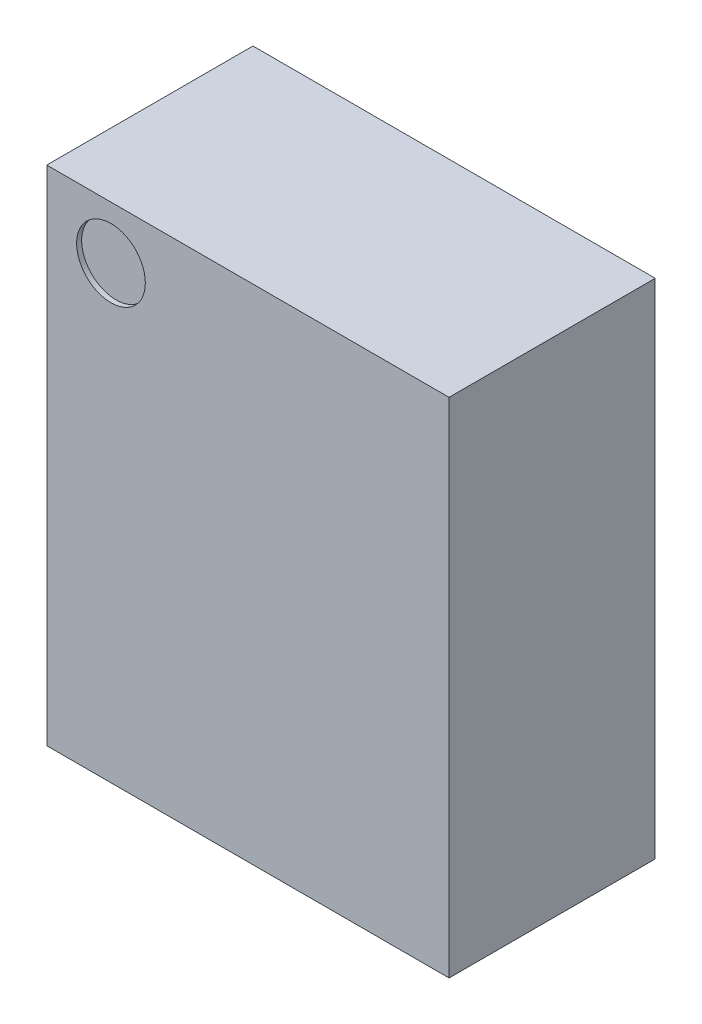
ISO-10303-21;
HEADER;
FILE_DESCRIPTION(('STEP AP214'),'2;1');
FILE_NAME('part.step','',(''),(''),'','','');
FILE_SCHEMA(('AUTOMOTIVE_DESIGN { 1 0 10303 214 1 1 1 1 }'));
ENDSEC;
DATA;
#1=APPLICATION_CONTEXT('core data for automotive mechanical design processes');
#2=APPLICATION_PROTOCOL_DEFINITION('international standard','automotive_design',2000,#1);
#3=PRODUCT_CONTEXT('',#1,'mechanical');
#4=PRODUCT('Part','Part','',(#3));
#5=PRODUCT_RELATED_PRODUCT_CATEGORY('part','',(#4));
#6=PRODUCT_DEFINITION_FORMATION('','',#4);
#7=PRODUCT_DEFINITION_CONTEXT('part definition',#1,'design');
#8=PRODUCT_DEFINITION('design','',#6,#7);
#9=PRODUCT_DEFINITION_SHAPE('','',#8);
#10=(LENGTH_UNIT() NAMED_UNIT(*) SI_UNIT(.MILLI.,.METRE.));
#11=(NAMED_UNIT(*) PLANE_ANGLE_UNIT() SI_UNIT($,.RADIAN.));
#12=(NAMED_UNIT(*) SI_UNIT($,.STERADIAN.) SOLID_ANGLE_UNIT());
#13=UNCERTAINTY_MEASURE_WITH_UNIT(LENGTH_MEASURE(1.E-05),#10,'distance_accuracy_value','');
#14=(GEOMETRIC_REPRESENTATION_CONTEXT(3) GLOBAL_UNCERTAINTY_ASSIGNED_CONTEXT((#13)) GLOBAL_UNIT_ASSIGNED_CONTEXT((#10,
#11,#12)) REPRESENTATION_CONTEXT('',''));
#15=CARTESIAN_POINT('',(0.,0.,0.));
#16=DIRECTION('',(0.,0.,1.));
#17=DIRECTION('',(1.,0.,0.));
#18=AXIS2_PLACEMENT_3D('',#15,#16,#17);
#19=CARTESIAN_POINT('',(0.,0.,0.));
#20=DIRECTION('',(0.,0.,-1.));
#21=DIRECTION('',(-1.,0.,0.));
#22=AXIS2_PLACEMENT_3D('',#19,#20,#21);
#23=PLANE('',#22);
#24=DIRECTION('',(0.,1.,0.));
#25=VECTOR('',#24,1.);
#26=CARTESIAN_POINT('',(-0.8,-1.,0.));
#27=LINE('',#26,#25);
#28=CARTESIAN_POINT('',(-0.8,-1.,0.));
#29=VERTEX_POINT('',#28);
#30=CARTESIAN_POINT('',(-0.8,1.,0.));
#31=VERTEX_POINT('',#30);
#32=EDGE_CURVE('E355',#29,#31,#27,.T.);
#33=ORIENTED_EDGE('',*,*,#32,.T.);
#34=DIRECTION('',(1.,0.,0.));
#35=VECTOR('',#34,1.);
#36=CARTESIAN_POINT('',(-0.8,1.,0.));
#37=LINE('',#36,#35);
#38=CARTESIAN_POINT('',(0.8,1.,0.));
#39=VERTEX_POINT('',#38);
#40=EDGE_CURVE('E377',#31,#39,#37,.T.);
#41=ORIENTED_EDGE('',*,*,#40,.T.);
#42=DIRECTION('',(0.,1.,0.));
#43=VECTOR('',#42,1.);
#44=CARTESIAN_POINT('',(0.8,-1.,0.));
#45=LINE('',#44,#43);
#46=CARTESIAN_POINT('',(0.8,-1.,0.));
#47=VERTEX_POINT('',#46);
#48=EDGE_CURVE('E381',#47,#39,#45,.T.);
#49=ORIENTED_EDGE('',*,*,#48,.F.);
#50=DIRECTION('',(1.,0.,0.));
#51=VECTOR('',#50,1.);
#52=CARTESIAN_POINT('',(-0.8,-1.,0.));
#53=LINE('',#52,#51);
#54=EDGE_CURVE('E364',#29,#47,#53,.T.);
#55=ORIENTED_EDGE('',*,*,#54,.F.);
#56=EDGE_LOOP('',(#33,#41,#49,#55));
#57=FACE_BOUND('',#56,.T.);
#58=DIRECTION('',(0.,1.,0.));
#59=VECTOR('',#58,1.);
#60=CARTESIAN_POINT('',(0.2,0.,0.));
#61=LINE('',#60,#59);
#62=CARTESIAN_POINT('',(0.2,0.625000000000003,0.));
#63=VERTEX_POINT('',#62);
#64=CARTESIAN_POINT('',(0.2,0.975000000000004,0.));
#65=VERTEX_POINT('',#64);
#66=EDGE_CURVE('E328',#63,#65,#61,.T.);
#67=ORIENTED_EDGE('',*,*,#66,.F.);
#68=DIRECTION('',(-1.,0.,0.));
#69=VECTOR('',#68,1.);
#70=CARTESIAN_POINT('',(0.,0.625000000000003,0.));
#71=LINE('',#70,#69);
#72=CARTESIAN_POINT('',(0.75,0.625000000000003,0.));
#73=VERTEX_POINT('',#72);
#74=EDGE_CURVE('E309',#73,#63,#71,.T.);
#75=ORIENTED_EDGE('',*,*,#74,.F.);
#76=DIRECTION('',(0.,-1.,0.));
#77=VECTOR('',#76,1.);
#78=CARTESIAN_POINT('',(0.75,0.,0.));
#79=LINE('',#78,#77);
#80=CARTESIAN_POINT('',(0.75,0.975000000000003,0.));
#81=VERTEX_POINT('',#80);
#82=EDGE_CURVE('E315',#81,#73,#79,.T.);
#83=ORIENTED_EDGE('',*,*,#82,.F.);
#84=DIRECTION('',(1.,0.,0.));
#85=VECTOR('',#84,1.);
#86=CARTESIAN_POINT('',(0.,0.975000000000004,0.));
#87=LINE('',#86,#85);
#88=EDGE_CURVE('E331',#65,#81,#87,.T.);
#89=ORIENTED_EDGE('',*,*,#88,.F.);
#90=EDGE_LOOP('',(#67,#75,#83,#89));
#91=FACE_BOUND('',#90,.T.);
#92=DIRECTION('',(1.,0.,0.));
#93=VECTOR('',#92,1.);
#94=CARTESIAN_POINT('',(0.,0.974999999999988,0.));
#95=LINE('',#94,#93);
#96=CARTESIAN_POINT('',(-0.6,0.975000000000004,0.));
#97=VERTEX_POINT('',#96);
#98=CARTESIAN_POINT('',(-0.2,0.974999999999993,0.));
#99=VERTEX_POINT('',#98);
#100=EDGE_CURVE('E279',#97,#99,#95,.T.);
#101=ORIENTED_EDGE('',*,*,#100,.F.);
#102=DIRECTION('',(0.707106781186548,0.707106781186547,0.));
#103=VECTOR('',#102,1.);
#104=CARTESIAN_POINT('',(-0.787500000000001,0.787500000000003,0.));
#105=LINE('',#104,#103);
#106=CARTESIAN_POINT('',(-0.75,0.825000000000004,0.));
#107=VERTEX_POINT('',#106);
#108=EDGE_CURVE('E257',#107,#97,#105,.T.);
#109=ORIENTED_EDGE('',*,*,#108,.F.);
#110=DIRECTION('',(0.,1.,0.));
#111=VECTOR('',#110,1.);
#112=CARTESIAN_POINT('',(-0.749999999999984,0.,0.));
#113=LINE('',#112,#111);
#114=CARTESIAN_POINT('',(-0.749999999999998,0.525000000000005,0.));
#115=VERTEX_POINT('',#114);
#116=EDGE_CURVE('E263',#115,#107,#113,.T.);
#117=ORIENTED_EDGE('',*,*,#116,.F.);
#118=DIRECTION('',(-1.,0.,0.));
#119=VECTOR('',#118,1.);
#120=CARTESIAN_POINT('',(0.,0.525000000000005,0.));
#121=LINE('',#120,#119);
#122=CARTESIAN_POINT('',(-0.199999999999997,0.525000000000005,0.));
#123=VERTEX_POINT('',#122);
#124=EDGE_CURVE('E285',#123,#115,#121,.T.);
#125=ORIENTED_EDGE('',*,*,#124,.F.);
#126=DIRECTION('',(0.,-1.,0.));
#127=VECTOR('',#126,1.);
#128=CARTESIAN_POINT('',(-0.199999999999984,0.,0.));
#129=LINE('',#128,#127);
#130=EDGE_CURVE('E282',#99,#123,#129,.T.);
#131=ORIENTED_EDGE('',*,*,#130,.F.);
#132=EDGE_LOOP('',(#101,#109,#117,#125,#131));
#133=FACE_BOUND('',#132,.T.);
#134=DIRECTION('',(0.,-1.,0.));
#135=VECTOR('',#134,1.);
#136=CARTESIAN_POINT('',(-0.199999999999983,0.,0.));
#137=LINE('',#136,#135);
#138=CARTESIAN_POINT('',(-0.199999999999983,-0.625000000000007,0.));
#139=VERTEX_POINT('',#138);
#140=CARTESIAN_POINT('',(-0.199999999999983,-0.975000000000007,0.));
#141=VERTEX_POINT('',#140);
#142=EDGE_CURVE('E218',#139,#141,#137,.T.);
#143=ORIENTED_EDGE('',*,*,#142,.F.);
#144=DIRECTION('',(1.,0.,0.));
#145=VECTOR('',#144,1.);
#146=CARTESIAN_POINT('',(0.,-0.625000000000007,0.));
#147=LINE('',#146,#145);
#148=CARTESIAN_POINT('',(-0.749999999999983,-0.625000000000007,0.));
#149=VERTEX_POINT('',#148);
#150=EDGE_CURVE('E213',#149,#139,#147,.T.);
#151=ORIENTED_EDGE('',*,*,#150,.F.);
#152=DIRECTION('',(0.,1.,0.));
#153=VECTOR('',#152,1.);
#154=CARTESIAN_POINT('',(-0.749999999999984,0.,0.));
#155=LINE('',#154,#153);
#156=CARTESIAN_POINT('',(-0.749999999999983,-0.975000000000007,0.));
#157=VERTEX_POINT('',#156);
#158=EDGE_CURVE('E228',#157,#149,#155,.T.);
#159=ORIENTED_EDGE('',*,*,#158,.F.);
#160=DIRECTION('',(-1.,0.,0.));
#161=VECTOR('',#160,1.);
#162=CARTESIAN_POINT('',(0.,-0.975000000000007,0.));
#163=LINE('',#162,#161);
#164=EDGE_CURVE('E240',#141,#157,#163,.T.);
#165=ORIENTED_EDGE('',*,*,#164,.F.);
#166=EDGE_LOOP('',(#143,#151,#159,#165));
#167=FACE_BOUND('',#166,.T.);
#168=DIRECTION('',(0.,-1.,0.));
#169=VECTOR('',#168,1.);
#170=CARTESIAN_POINT('',(0.750000000000017,0.,0.));
#171=LINE('',#170,#169);
#172=CARTESIAN_POINT('',(0.750000000000017,-0.625,0.));
#173=VERTEX_POINT('',#172);
#174=CARTESIAN_POINT('',(0.750000000000017,-0.975,0.));
#175=VERTEX_POINT('',#174);
#176=EDGE_CURVE('E682',#173,#175,#171,.T.);
#177=ORIENTED_EDGE('',*,*,#176,.F.);
#178=DIRECTION('',(1.,0.,0.));
#179=VECTOR('',#178,1.);
#180=CARTESIAN_POINT('',(0.,-0.625,0.));
#181=LINE('',#180,#179);
#182=CARTESIAN_POINT('',(0.200000000000017,-0.625,0.));
#183=VERTEX_POINT('',#182);
#184=EDGE_CURVE('E210',#183,#173,#181,.T.);
#185=ORIENTED_EDGE('',*,*,#184,.F.);
#186=DIRECTION('',(0.,1.,0.));
#187=VECTOR('',#186,1.);
#188=CARTESIAN_POINT('',(0.200000000000016,0.,0.));
#189=LINE('',#188,#187);
#190=CARTESIAN_POINT('',(0.200000000000017,-0.975,0.));
#191=VERTEX_POINT('',#190);
#192=EDGE_CURVE('E206',#191,#183,#189,.T.);
#193=ORIENTED_EDGE('',*,*,#192,.F.);
#194=DIRECTION('',(-1.,0.,0.));
#195=VECTOR('',#194,1.);
#196=CARTESIAN_POINT('',(0.,-0.975,0.));
#197=LINE('',#196,#195);
#198=EDGE_CURVE('E678',#175,#191,#197,.T.);
#199=ORIENTED_EDGE('',*,*,#198,.F.);
#200=EDGE_LOOP('',(#177,#185,#193,#199));
#201=FACE_BOUND('',#200,.T.);
#202=ADVANCED_FACE('F39',(#57,#91,#133,#167,#201),#23,.T.);
#203=CARTESIAN_POINT('',(-0.8,-1.,0.82));
#204=DIRECTION('',(-1.,0.,0.));
#205=DIRECTION('',(0.,0.,1.));
#206=AXIS2_PLACEMENT_3D('',#203,#204,#205);
#207=PLANE('',#206);
#208=ORIENTED_EDGE('',*,*,#32,.F.);
#209=DIRECTION('',(0.,0.,-1.));
#210=VECTOR('',#209,1.);
#211=CARTESIAN_POINT('',(-0.8,-1.,0.82));
#212=LINE('',#211,#210);
#213=CARTESIAN_POINT('',(-0.8,-1.,0.82));
#214=VERTEX_POINT('',#213);
#215=EDGE_CURVE('E11',#214,#29,#212,.T.);
#216=ORIENTED_EDGE('',*,*,#215,.F.);
#217=DIRECTION('',(0.,1.,0.));
#218=VECTOR('',#217,1.);
#219=CARTESIAN_POINT('',(-0.8,-1.,0.82));
#220=LINE('',#219,#218);
#221=CARTESIAN_POINT('',(-0.8,1.,0.82));
#222=VERTEX_POINT('',#221);
#223=EDGE_CURVE('E359',#214,#222,#220,.T.);
#224=ORIENTED_EDGE('',*,*,#223,.T.);
#225=DIRECTION('',(0.,0.,-1.));
#226=VECTOR('',#225,1.);
#227=CARTESIAN_POINT('',(-0.8,1.,0.82));
#228=LINE('',#227,#226);
#229=EDGE_CURVE('E43',#222,#31,#228,.T.);
#230=ORIENTED_EDGE('',*,*,#229,.T.);
#231=EDGE_LOOP('',(#208,#216,#224,#230));
#232=FACE_BOUND('',#231,.T.);
#233=ADVANCED_FACE('F41',(#232),#207,.T.);
#234=CARTESIAN_POINT('',(-0.8,-1.,0.82));
#235=DIRECTION('',(0.,1.,0.));
#236=DIRECTION('',(0.,0.,1.));
#237=AXIS2_PLACEMENT_3D('',#234,#235,#236);
#238=PLANE('',#237);
#239=ORIENTED_EDGE('',*,*,#54,.T.);
#240=DIRECTION('',(0.,0.,-1.));
#241=VECTOR('',#240,1.);
#242=CARTESIAN_POINT('',(0.8,-1.,0.82));
#243=LINE('',#242,#241);
#244=CARTESIAN_POINT('',(0.8,-1.,0.82));
#245=VERTEX_POINT('',#244);
#246=EDGE_CURVE('E49',#245,#47,#243,.T.);
#247=ORIENTED_EDGE('',*,*,#246,.F.);
#248=DIRECTION('',(1.,0.,0.));
#249=VECTOR('',#248,1.);
#250=CARTESIAN_POINT('',(-0.8,-1.,0.82));
#251=LINE('',#250,#249);
#252=EDGE_CURVE('E371',#214,#245,#251,.T.);
#253=ORIENTED_EDGE('',*,*,#252,.F.);
#254=ORIENTED_EDGE('',*,*,#215,.T.);
#255=EDGE_LOOP('',(#239,#247,#253,#254));
#256=FACE_BOUND('',#255,.T.);
#257=ADVANCED_FACE('F406',(#256),#238,.F.);
#258=CARTESIAN_POINT('',(0.8,-1.,0.82));
#259=DIRECTION('',(-1.,0.,0.));
#260=DIRECTION('',(0.,0.,1.));
#261=AXIS2_PLACEMENT_3D('',#258,#259,#260);
#262=PLANE('',#261);
#263=ORIENTED_EDGE('',*,*,#48,.T.);
#264=DIRECTION('',(0.,0.,-1.));
#265=VECTOR('',#264,1.);
#266=CARTESIAN_POINT('',(0.8,1.,0.82));
#267=LINE('',#266,#265);
#268=CARTESIAN_POINT('',(0.8,1.,0.82));
#269=VERTEX_POINT('',#268);
#270=EDGE_CURVE('E389',#269,#39,#267,.T.);
#271=ORIENTED_EDGE('',*,*,#270,.F.);
#272=DIRECTION('',(0.,1.,0.));
#273=VECTOR('',#272,1.);
#274=CARTESIAN_POINT('',(0.8,-1.,0.82));
#275=LINE('',#274,#273);
#276=EDGE_CURVE('E368',#245,#269,#275,.T.);
#277=ORIENTED_EDGE('',*,*,#276,.F.);
#278=ORIENTED_EDGE('',*,*,#246,.T.);
#279=EDGE_LOOP('',(#263,#271,#277,#278));
#280=FACE_BOUND('',#279,.T.);
#281=ADVANCED_FACE('F410',(#280),#262,.F.);
#282=CARTESIAN_POINT('',(-0.8,1.,0.82));
#283=DIRECTION('',(0.,1.,0.));
#284=DIRECTION('',(0.,0.,1.));
#285=AXIS2_PLACEMENT_3D('',#282,#283,#284);
#286=PLANE('',#285);
#287=ORIENTED_EDGE('',*,*,#40,.F.);
#288=ORIENTED_EDGE('',*,*,#229,.F.);
#289=DIRECTION('',(1.,0.,0.));
#290=VECTOR('',#289,1.);
#291=CARTESIAN_POINT('',(-0.8,1.,0.82));
#292=LINE('',#291,#290);
#293=EDGE_CURVE('E363',#222,#269,#292,.T.);
#294=ORIENTED_EDGE('',*,*,#293,.T.);
#295=ORIENTED_EDGE('',*,*,#270,.T.);
#296=EDGE_LOOP('',(#287,#288,#294,#295));
#297=FACE_BOUND('',#296,.T.);
#298=ADVANCED_FACE('F399',(#297),#286,.T.);
#299=CARTESIAN_POINT('',(0.,0.,0.82));
#300=DIRECTION('',(0.,0.,-1.));
#301=DIRECTION('',(-1.,0.,0.));
#302=AXIS2_PLACEMENT_3D('',#299,#300,#301);
#303=PLANE('',#302);
#304=CARTESIAN_POINT('',(-0.544602285287965,0.789885910222665,0.82));
#305=DIRECTION('',(0.,0.,1.));
#306=DIRECTION('',(1.,0.,0.));
#307=AXIS2_PLACEMENT_3D('',#304,#305,#306);
#308=CIRCLE('',#307,0.136611136419056);
#309=CARTESIAN_POINT('',(-0.407991148868909,0.789885910222665,0.82));
#310=VERTEX_POINT('',#309);
#311=EDGE_CURVE('E350',#310,#310,#308,.T.);
#312=ORIENTED_EDGE('',*,*,#311,.F.);
#313=EDGE_LOOP('',(#312));
#314=FACE_BOUND('',#313,.T.);
#315=ORIENTED_EDGE('',*,*,#223,.F.);
#316=ORIENTED_EDGE('',*,*,#252,.T.);
#317=ORIENTED_EDGE('',*,*,#276,.T.);
#318=ORIENTED_EDGE('',*,*,#293,.F.);
#319=EDGE_LOOP('',(#315,#316,#317,#318));
#320=FACE_BOUND('',#319,.T.);
#321=ADVANCED_FACE('F412',(#314,#320),#303,.F.);
#322=CARTESIAN_POINT('',(-0.544602285287965,0.789885910222665,0.8));
#323=DIRECTION('',(0.,0.,1.));
#324=DIRECTION('',(1.,0.,0.));
#325=AXIS2_PLACEMENT_3D('',#322,#323,#324);
#326=CYLINDRICAL_SURFACE('',#325,0.136611136419056);
#327=CARTESIAN_POINT('',(-0.544602285287965,0.789885910222665,0.8));
#328=DIRECTION('',(0.,0.,1.));
#329=DIRECTION('',(1.,0.,0.));
#330=AXIS2_PLACEMENT_3D('',#327,#328,#329);
#331=CIRCLE('',#330,0.136611136419056);
#332=CARTESIAN_POINT('',(-0.407991148868909,0.789885910222665,0.8));
#333=VERTEX_POINT('',#332);
#334=EDGE_CURVE('E351',#333,#333,#331,.T.);
#335=ORIENTED_EDGE('',*,*,#334,.F.);
#336=EDGE_LOOP('',(#335));
#337=FACE_BOUND('',#336,.T.);
#338=ORIENTED_EDGE('',*,*,#311,.T.);
#339=EDGE_LOOP('',(#338));
#340=FACE_BOUND('',#339,.T.);
#341=ADVANCED_FACE('F414',(#337,#340),#326,.F.);
#342=CARTESIAN_POINT('',(-0.544602285287965,0.789885910222665,0.8));
#343=DIRECTION('',(0.,0.,1.));
#344=DIRECTION('',(1.,0.,0.));
#345=AXIS2_PLACEMENT_3D('',#342,#343,#344);
#346=PLANE('',#345);
#347=ORIENTED_EDGE('',*,*,#334,.T.);
#348=EDGE_LOOP('',(#347));
#349=FACE_BOUND('',#348,.T.);
#350=ADVANCED_FACE('F421',(#349),#346,.T.);
#351=CARTESIAN_POINT('',(0.,0.625000000000003,-0.02));
#352=DIRECTION('',(0.,1.,0.));
#353=DIRECTION('',(-1.,0.,0.));
#354=AXIS2_PLACEMENT_3D('',#351,#352,#353);
#355=PLANE('',#354);
#356=ORIENTED_EDGE('',*,*,#74,.T.);
#357=DIRECTION('',(0.,0.,1.));
#358=VECTOR('',#357,1.);
#359=CARTESIAN_POINT('',(0.2,0.625000000000003,-0.02));
#360=LINE('',#359,#358);
#361=CARTESIAN_POINT('',(0.2,0.625000000000003,-0.02));
#362=VERTEX_POINT('',#361);
#363=EDGE_CURVE('E347',#362,#63,#360,.T.);
#364=ORIENTED_EDGE('',*,*,#363,.F.);
#365=DIRECTION('',(-1.,0.,0.));
#366=VECTOR('',#365,1.);
#367=CARTESIAN_POINT('',(0.,0.625000000000003,-0.02));
#368=LINE('',#367,#366);
#369=CARTESIAN_POINT('',(0.75,0.625000000000003,-0.02));
#370=VERTEX_POINT('',#369);
#371=EDGE_CURVE('E310',#370,#362,#368,.T.);
#372=ORIENTED_EDGE('',*,*,#371,.F.);
#373=DIRECTION('',(0.,0.,1.));
#374=VECTOR('',#373,1.);
#375=CARTESIAN_POINT('',(0.75,0.625000000000003,-0.02));
#376=LINE('',#375,#374);
#377=EDGE_CURVE('E324',#370,#73,#376,.T.);
#378=ORIENTED_EDGE('',*,*,#377,.T.);
#379=EDGE_LOOP('',(#356,#364,#372,#378));
#380=FACE_BOUND('',#379,.T.);
#381=ADVANCED_FACE('F460',(#380),#355,.F.);
#382=CARTESIAN_POINT('',(0.2,0.,-0.02));
#383=DIRECTION('',(1.,0.,0.));
#384=DIRECTION('',(0.,1.,0.));
#385=AXIS2_PLACEMENT_3D('',#382,#383,#384);
#386=PLANE('',#385);
#387=ORIENTED_EDGE('',*,*,#66,.T.);
#388=DIRECTION('',(0.,0.,1.));
#389=VECTOR('',#388,1.);
#390=CARTESIAN_POINT('',(0.2,0.975000000000004,-0.02));
#391=LINE('',#390,#389);
#392=CARTESIAN_POINT('',(0.2,0.975000000000004,-0.02));
#393=VERTEX_POINT('',#392);
#394=EDGE_CURVE('E343',#393,#65,#391,.T.);
#395=ORIENTED_EDGE('',*,*,#394,.F.);
#396=DIRECTION('',(0.,1.,0.));
#397=VECTOR('',#396,1.);
#398=CARTESIAN_POINT('',(0.2,0.,-0.02));
#399=LINE('',#398,#397);
#400=EDGE_CURVE('E314',#362,#393,#399,.T.);
#401=ORIENTED_EDGE('',*,*,#400,.F.);
#402=ORIENTED_EDGE('',*,*,#363,.T.);
#403=EDGE_LOOP('',(#387,#395,#401,#402));
#404=FACE_BOUND('',#403,.T.);
#405=ADVANCED_FACE('F475',(#404),#386,.F.);
#406=CARTESIAN_POINT('',(0.,0.975000000000004,-0.02));
#407=DIRECTION('',(0.,-1.,0.));
#408=DIRECTION('',(1.,0.,0.));
#409=AXIS2_PLACEMENT_3D('',#406,#407,#408);
#410=PLANE('',#409);
#411=ORIENTED_EDGE('',*,*,#88,.T.);
#412=DIRECTION('',(0.,0.,1.));
#413=VECTOR('',#412,1.);
#414=CARTESIAN_POINT('',(0.75,0.975000000000003,-0.02));
#415=LINE('',#414,#413);
#416=CARTESIAN_POINT('',(0.75,0.975000000000003,-0.02));
#417=VERTEX_POINT('',#416);
#418=EDGE_CURVE('E340',#417,#81,#415,.T.);
#419=ORIENTED_EDGE('',*,*,#418,.F.);
#420=DIRECTION('',(1.,0.,0.));
#421=VECTOR('',#420,1.);
#422=CARTESIAN_POINT('',(0.,0.975000000000004,-0.02));
#423=LINE('',#422,#421);
#424=EDGE_CURVE('E318',#393,#417,#423,.T.);
#425=ORIENTED_EDGE('',*,*,#424,.F.);
#426=ORIENTED_EDGE('',*,*,#394,.T.);
#427=EDGE_LOOP('',(#411,#419,#425,#426));
#428=FACE_BOUND('',#427,.T.);
#429=ADVANCED_FACE('F485',(#428),#410,.F.);
#430=CARTESIAN_POINT('',(0.75,0.,-0.02));
#431=DIRECTION('',(-1.,0.,0.));
#432=DIRECTION('',(0.,0.,1.));
#433=AXIS2_PLACEMENT_3D('',#430,#431,#432);
#434=PLANE('',#433);
#435=ORIENTED_EDGE('',*,*,#82,.T.);
#436=ORIENTED_EDGE('',*,*,#377,.F.);
#437=DIRECTION('',(0.,-1.,0.));
#438=VECTOR('',#437,1.);
#439=CARTESIAN_POINT('',(0.75,0.,-0.02));
#440=LINE('',#439,#438);
#441=EDGE_CURVE('E321',#417,#370,#440,.T.);
#442=ORIENTED_EDGE('',*,*,#441,.F.);
#443=ORIENTED_EDGE('',*,*,#418,.T.);
#444=EDGE_LOOP('',(#435,#436,#442,#443));
#445=FACE_BOUND('',#444,.T.);
#446=ADVANCED_FACE('F495',(#445),#434,.F.);
#447=CARTESIAN_POINT('',(0.,0.,-0.02));
#448=DIRECTION('',(0.,0.,-1.));
#449=DIRECTION('',(-1.,0.,0.));
#450=AXIS2_PLACEMENT_3D('',#447,#448,#449);
#451=PLANE('',#450);
#452=ORIENTED_EDGE('',*,*,#371,.T.);
#453=ORIENTED_EDGE('',*,*,#400,.T.);
#454=ORIENTED_EDGE('',*,*,#424,.T.);
#455=ORIENTED_EDGE('',*,*,#441,.T.);
#456=EDGE_LOOP('',(#452,#453,#454,#455));
#457=FACE_BOUND('',#456,.T.);
#458=ADVANCED_FACE('F505',(#457),#451,.T.);
#459=CARTESIAN_POINT('',(-0.787500000000001,0.787500000000003,-0.02));
#460=DIRECTION('',(0.707106781186547,-0.707106781186548,0.));
#461=DIRECTION('',(0.707106781186548,0.707106781186547,0.));
#462=AXIS2_PLACEMENT_3D('',#459,#460,#461);
#463=PLANE('',#462);
#464=ORIENTED_EDGE('',*,*,#108,.T.);
#465=DIRECTION('',(0.,0.,1.));
#466=VECTOR('',#465,1.);
#467=CARTESIAN_POINT('',(-0.6,0.975000000000004,-0.02));
#468=LINE('',#467,#466);
#469=CARTESIAN_POINT('',(-0.6,0.975000000000004,-0.02));
#470=VERTEX_POINT('',#469);
#471=EDGE_CURVE('E301',#470,#97,#468,.T.);
#472=ORIENTED_EDGE('',*,*,#471,.F.);
#473=DIRECTION('',(0.707106781186548,0.707106781186547,0.));
#474=VECTOR('',#473,1.);
#475=CARTESIAN_POINT('',(-0.787500000000001,0.787500000000003,-0.02));
#476=LINE('',#475,#474);
#477=CARTESIAN_POINT('',(-0.75,0.825000000000004,-0.02));
#478=VERTEX_POINT('',#477);
#479=EDGE_CURVE('E262',#478,#470,#476,.T.);
#480=ORIENTED_EDGE('',*,*,#479,.F.);
#481=DIRECTION('',(0.,0.,1.));
#482=VECTOR('',#481,1.);
#483=CARTESIAN_POINT('',(-0.75,0.825000000000004,-0.02));
#484=LINE('',#483,#482);
#485=EDGE_CURVE('E305',#478,#107,#484,.T.);
#486=ORIENTED_EDGE('',*,*,#485,.T.);
#487=EDGE_LOOP('',(#464,#472,#480,#486));
#488=FACE_BOUND('',#487,.T.);
#489=ADVANCED_FACE('F515',(#488),#463,.F.);
#490=CARTESIAN_POINT('',(0.,0.974999999999988,-0.02));
#491=DIRECTION('',(0.,-1.,0.));
#492=DIRECTION('',(1.,0.,0.));
#493=AXIS2_PLACEMENT_3D('',#490,#491,#492);
#494=PLANE('',#493);
#495=ORIENTED_EDGE('',*,*,#100,.T.);
#496=DIRECTION('',(0.,0.,1.));
#497=VECTOR('',#496,1.);
#498=CARTESIAN_POINT('',(-0.2,0.974999999999993,-0.02));
#499=LINE('',#498,#497);
#500=CARTESIAN_POINT('',(-0.2,0.974999999999993,-0.02));
#501=VERTEX_POINT('',#500);
#502=EDGE_CURVE('E297',#501,#99,#499,.T.);
#503=ORIENTED_EDGE('',*,*,#502,.F.);
#504=DIRECTION('',(1.,0.,0.));
#505=VECTOR('',#504,1.);
#506=CARTESIAN_POINT('',(0.,0.974999999999988,-0.02));
#507=LINE('',#506,#505);
#508=EDGE_CURVE('E266',#470,#501,#507,.T.);
#509=ORIENTED_EDGE('',*,*,#508,.F.);
#510=ORIENTED_EDGE('',*,*,#471,.T.);
#511=EDGE_LOOP('',(#495,#503,#509,#510));
#512=FACE_BOUND('',#511,.T.);
#513=ADVANCED_FACE('F525',(#512),#494,.F.);
#514=CARTESIAN_POINT('',(-0.199999999999984,0.,-0.02));
#515=DIRECTION('',(-1.,0.,0.));
#516=DIRECTION('',(0.,-1.,0.));
#517=AXIS2_PLACEMENT_3D('',#514,#515,#516);
#518=PLANE('',#517);
#519=ORIENTED_EDGE('',*,*,#130,.T.);
#520=DIRECTION('',(0.,0.,1.));
#521=VECTOR('',#520,1.);
#522=CARTESIAN_POINT('',(-0.199999999999997,0.525000000000005,-0.02));
#523=LINE('',#522,#521);
#524=CARTESIAN_POINT('',(-0.199999999999997,0.525000000000005,-0.02));
#525=VERTEX_POINT('',#524);
#526=EDGE_CURVE('E293',#525,#123,#523,.T.);
#527=ORIENTED_EDGE('',*,*,#526,.F.);
#528=DIRECTION('',(0.,-1.,0.));
#529=VECTOR('',#528,1.);
#530=CARTESIAN_POINT('',(-0.2,0.,-0.02));
#531=LINE('',#530,#529);
#532=EDGE_CURVE('E269',#501,#525,#531,.T.);
#533=ORIENTED_EDGE('',*,*,#532,.F.);
#534=ORIENTED_EDGE('',*,*,#502,.T.);
#535=EDGE_LOOP('',(#519,#527,#533,#534));
#536=FACE_BOUND('',#535,.T.);
#537=ADVANCED_FACE('F535',(#536),#518,.F.);
#538=CARTESIAN_POINT('',(0.,0.525000000000005,-0.02));
#539=DIRECTION('',(0.,1.,0.));
#540=DIRECTION('',(0.,0.,1.));
#541=AXIS2_PLACEMENT_3D('',#538,#539,#540);
#542=PLANE('',#541);
#543=ORIENTED_EDGE('',*,*,#124,.T.);
#544=DIRECTION('',(0.,0.,1.));
#545=VECTOR('',#544,1.);
#546=CARTESIAN_POINT('',(-0.749999999999998,0.525000000000005,-0.02));
#547=LINE('',#546,#545);
#548=CARTESIAN_POINT('',(-0.749999999999998,0.525000000000005,-0.02));
#549=VERTEX_POINT('',#548);
#550=EDGE_CURVE('E276',#549,#115,#547,.T.);
#551=ORIENTED_EDGE('',*,*,#550,.F.);
#552=DIRECTION('',(-1.,0.,0.));
#553=VECTOR('',#552,1.);
#554=CARTESIAN_POINT('',(0.,0.525000000000005,-0.02));
#555=LINE('',#554,#553);
#556=EDGE_CURVE('E272',#525,#549,#555,.T.);
#557=ORIENTED_EDGE('',*,*,#556,.F.);
#558=ORIENTED_EDGE('',*,*,#526,.T.);
#559=EDGE_LOOP('',(#543,#551,#557,#558));
#560=FACE_BOUND('',#559,.T.);
#561=ADVANCED_FACE('F546',(#560),#542,.F.);
#562=CARTESIAN_POINT('',(-0.749999999999984,0.,-0.02));
#563=DIRECTION('',(1.,0.,0.));
#564=DIRECTION('',(0.,1.,0.));
#565=AXIS2_PLACEMENT_3D('',#562,#563,#564);
#566=PLANE('',#565);
#567=ORIENTED_EDGE('',*,*,#116,.T.);
#568=ORIENTED_EDGE('',*,*,#485,.F.);
#569=DIRECTION('',(0.,1.,0.));
#570=VECTOR('',#569,1.);
#571=CARTESIAN_POINT('',(-0.75,0.,-0.02));
#572=LINE('',#571,#570);
#573=EDGE_CURVE('E258',#549,#478,#572,.T.);
#574=ORIENTED_EDGE('',*,*,#573,.F.);
#575=ORIENTED_EDGE('',*,*,#550,.T.);
#576=EDGE_LOOP('',(#567,#568,#574,#575));
#577=FACE_BOUND('',#576,.T.);
#578=ADVANCED_FACE('F556',(#577),#566,.F.);
#579=CARTESIAN_POINT('',(0.,0.,-0.02));
#580=DIRECTION('',(0.,0.,-1.));
#581=DIRECTION('',(-1.,0.,0.));
#582=AXIS2_PLACEMENT_3D('',#579,#580,#581);
#583=PLANE('',#582);
#584=ORIENTED_EDGE('',*,*,#573,.T.);
#585=ORIENTED_EDGE('',*,*,#479,.T.);
#586=ORIENTED_EDGE('',*,*,#508,.T.);
#587=ORIENTED_EDGE('',*,*,#532,.T.);
#588=ORIENTED_EDGE('',*,*,#556,.T.);
#589=EDGE_LOOP('',(#584,#585,#586,#587,#588));
#590=FACE_BOUND('',#589,.T.);
#591=ADVANCED_FACE('F567',(#590),#583,.T.);
#592=CARTESIAN_POINT('',(0.,-0.625000000000007,-0.02));
#593=DIRECTION('',(0.,-1.,0.));
#594=DIRECTION('',(1.,0.,0.));
#595=AXIS2_PLACEMENT_3D('',#592,#593,#594);
#596=PLANE('',#595);
#597=ORIENTED_EDGE('',*,*,#150,.T.);
#598=DIRECTION('',(0.,0.,1.));
#599=VECTOR('',#598,1.);
#600=CARTESIAN_POINT('',(-0.199999999999983,-0.625000000000007,-0.02));
#601=LINE('',#600,#599);
#602=CARTESIAN_POINT('',(-0.199999999999983,-0.625000000000007,-0.02));
#603=VERTEX_POINT('',#602);
#604=EDGE_CURVE('E254',#603,#139,#601,.T.);
#605=ORIENTED_EDGE('',*,*,#604,.F.);
#606=DIRECTION('',(1.,0.,0.));
#607=VECTOR('',#606,1.);
#608=CARTESIAN_POINT('',(0.,-0.625000000000007,-0.02));
#609=LINE('',#608,#607);
#610=CARTESIAN_POINT('',(-0.749999999999983,-0.625000000000007,-0.02));
#611=VERTEX_POINT('',#610);
#612=EDGE_CURVE('E223',#611,#603,#609,.T.);
#613=ORIENTED_EDGE('',*,*,#612,.F.);
#614=DIRECTION('',(0.,0.,1.));
#615=VECTOR('',#614,1.);
#616=CARTESIAN_POINT('',(-0.749999999999983,-0.625000000000007,-0.02));
#617=LINE('',#616,#615);
#618=EDGE_CURVE('E236',#611,#149,#617,.T.);
#619=ORIENTED_EDGE('',*,*,#618,.T.);
#620=EDGE_LOOP('',(#597,#605,#613,#619));
#621=FACE_BOUND('',#620,.T.);
#622=ADVANCED_FACE('F577',(#621),#596,.F.);
#623=CARTESIAN_POINT('',(-0.199999999999983,0.,-0.02));
#624=DIRECTION('',(-1.,0.,0.));
#625=DIRECTION('',(0.,0.,1.));
#626=AXIS2_PLACEMENT_3D('',#623,#624,#625);
#627=PLANE('',#626);
#628=ORIENTED_EDGE('',*,*,#142,.T.);
#629=DIRECTION('',(0.,0.,1.));
#630=VECTOR('',#629,1.);
#631=CARTESIAN_POINT('',(-0.199999999999983,-0.975000000000007,-0.02));
#632=LINE('',#631,#630);
#633=CARTESIAN_POINT('',(-0.199999999999983,-0.975000000000007,-0.02));
#634=VERTEX_POINT('',#633);
#635=EDGE_CURVE('E250',#634,#141,#632,.T.);
#636=ORIENTED_EDGE('',*,*,#635,.F.);
#637=DIRECTION('',(0.,-1.,0.));
#638=VECTOR('',#637,1.);
#639=CARTESIAN_POINT('',(-0.199999999999983,0.,-0.02));
#640=LINE('',#639,#638);
#641=EDGE_CURVE('E227',#603,#634,#640,.T.);
#642=ORIENTED_EDGE('',*,*,#641,.F.);
#643=ORIENTED_EDGE('',*,*,#604,.T.);
#644=EDGE_LOOP('',(#628,#636,#642,#643));
#645=FACE_BOUND('',#644,.T.);
#646=ADVANCED_FACE('F587',(#645),#627,.F.);
#647=CARTESIAN_POINT('',(0.,-0.975000000000007,-0.02));
#648=DIRECTION('',(0.,1.,0.));
#649=DIRECTION('',(-1.,0.,0.));
#650=AXIS2_PLACEMENT_3D('',#647,#648,#649);
#651=PLANE('',#650);
#652=ORIENTED_EDGE('',*,*,#164,.T.);
#653=DIRECTION('',(0.,0.,1.));
#654=VECTOR('',#653,1.);
#655=CARTESIAN_POINT('',(-0.749999999999983,-0.975000000000007,-0.02));
#656=LINE('',#655,#654);
#657=CARTESIAN_POINT('',(-0.749999999999983,-0.975000000000007,-0.02));
#658=VERTEX_POINT('',#657);
#659=EDGE_CURVE('E65',#658,#157,#656,.T.);
#660=ORIENTED_EDGE('',*,*,#659,.F.);
#661=DIRECTION('',(-1.,0.,0.));
#662=VECTOR('',#661,1.);
#663=CARTESIAN_POINT('',(0.,-0.975000000000007,-0.02));
#664=LINE('',#663,#662);
#665=EDGE_CURVE('E231',#634,#658,#664,.T.);
#666=ORIENTED_EDGE('',*,*,#665,.F.);
#667=ORIENTED_EDGE('',*,*,#635,.T.);
#668=EDGE_LOOP('',(#652,#660,#666,#667));
#669=FACE_BOUND('',#668,.T.);
#670=ADVANCED_FACE('F597',(#669),#651,.F.);
#671=CARTESIAN_POINT('',(-0.749999999999984,0.,-0.02));
#672=DIRECTION('',(1.,0.,0.));
#673=DIRECTION('',(0.,1.,0.));
#674=AXIS2_PLACEMENT_3D('',#671,#672,#673);
#675=PLANE('',#674);
#676=ORIENTED_EDGE('',*,*,#158,.T.);
#677=ORIENTED_EDGE('',*,*,#618,.F.);
#678=DIRECTION('',(0.,1.,0.));
#679=VECTOR('',#678,1.);
#680=CARTESIAN_POINT('',(-0.749999999999984,0.,-0.02));
#681=LINE('',#680,#679);
#682=EDGE_CURVE('E234',#658,#611,#681,.T.);
#683=ORIENTED_EDGE('',*,*,#682,.F.);
#684=ORIENTED_EDGE('',*,*,#659,.T.);
#685=EDGE_LOOP('',(#676,#677,#683,#684));
#686=FACE_BOUND('',#685,.T.);
#687=ADVANCED_FACE('F607',(#686),#675,.F.);
#688=CARTESIAN_POINT('',(0.,0.,-0.02));
#689=DIRECTION('',(0.,0.,-1.));
#690=DIRECTION('',(-1.,0.,0.));
#691=AXIS2_PLACEMENT_3D('',#688,#689,#690);
#692=PLANE('',#691);
#693=ORIENTED_EDGE('',*,*,#612,.T.);
#694=ORIENTED_EDGE('',*,*,#641,.T.);
#695=ORIENTED_EDGE('',*,*,#665,.T.);
#696=ORIENTED_EDGE('',*,*,#682,.T.);
#697=EDGE_LOOP('',(#693,#694,#695,#696));
#698=FACE_BOUND('',#697,.T.);
#699=ADVANCED_FACE('F617',(#698),#692,.T.);
#700=CARTESIAN_POINT('',(0.,-0.625,-0.02));
#701=DIRECTION('',(0.,-1.,0.));
#702=DIRECTION('',(1.,0.,0.));
#703=AXIS2_PLACEMENT_3D('',#700,#701,#702);
#704=PLANE('',#703);
#705=ORIENTED_EDGE('',*,*,#184,.T.);
#706=DIRECTION('',(0.,0.,1.));
#707=VECTOR('',#706,1.);
#708=CARTESIAN_POINT('',(0.750000000000017,-0.625,-0.02));
#709=LINE('',#708,#707);
#710=CARTESIAN_POINT('',(0.750000000000017,-0.625,-0.02));
#711=VERTEX_POINT('',#710);
#712=EDGE_CURVE('E189',#711,#173,#709,.T.);
#713=ORIENTED_EDGE('',*,*,#712,.F.);
#714=DIRECTION('',(1.,0.,0.));
#715=VECTOR('',#714,1.);
#716=CARTESIAN_POINT('',(0.,-0.625,-0.02));
#717=LINE('',#716,#715);
#718=CARTESIAN_POINT('',(0.200000000000017,-0.625,-0.02));
#719=VERTEX_POINT('',#718);
#720=EDGE_CURVE('E197',#719,#711,#717,.T.);
#721=ORIENTED_EDGE('',*,*,#720,.F.);
#722=DIRECTION('',(0.,0.,1.));
#723=VECTOR('',#722,1.);
#724=CARTESIAN_POINT('',(0.200000000000017,-0.625,-0.02));
#725=LINE('',#724,#723);
#726=EDGE_CURVE('E674',#719,#183,#725,.T.);
#727=ORIENTED_EDGE('',*,*,#726,.T.);
#728=EDGE_LOOP('',(#705,#713,#721,#727));
#729=FACE_BOUND('',#728,.T.);
#730=ADVANCED_FACE('F208',(#729),#704,.F.);
#731=CARTESIAN_POINT('',(0.750000000000017,0.,-0.02));
#732=DIRECTION('',(-1.,0.,0.));
#733=DIRECTION('',(0.,0.,1.));
#734=AXIS2_PLACEMENT_3D('',#731,#732,#733);
#735=PLANE('',#734);
#736=ORIENTED_EDGE('',*,*,#176,.T.);
#737=DIRECTION('',(0.,0.,1.));
#738=VECTOR('',#737,1.);
#739=CARTESIAN_POINT('',(0.750000000000017,-0.975,-0.02));
#740=LINE('',#739,#738);
#741=CARTESIAN_POINT('',(0.750000000000017,-0.975,-0.02));
#742=VERTEX_POINT('',#741);
#743=EDGE_CURVE('E192',#742,#175,#740,.T.);
#744=ORIENTED_EDGE('',*,*,#743,.F.);
#745=DIRECTION('',(0.,-1.,0.));
#746=VECTOR('',#745,1.);
#747=CARTESIAN_POINT('',(0.750000000000017,0.,-0.02));
#748=LINE('',#747,#746);
#749=EDGE_CURVE('E185',#711,#742,#748,.T.);
#750=ORIENTED_EDGE('',*,*,#749,.F.);
#751=ORIENTED_EDGE('',*,*,#712,.T.);
#752=EDGE_LOOP('',(#736,#744,#750,#751));
#753=FACE_BOUND('',#752,.T.);
#754=ADVANCED_FACE('F187',(#753),#735,.F.);
#755=CARTESIAN_POINT('',(0.,-0.975,-0.02));
#756=DIRECTION('',(0.,1.,0.));
#757=DIRECTION('',(-1.,0.,0.));
#758=AXIS2_PLACEMENT_3D('',#755,#756,#757);
#759=PLANE('',#758);
#760=ORIENTED_EDGE('',*,*,#198,.T.);
#761=DIRECTION('',(0.,0.,1.));
#762=VECTOR('',#761,1.);
#763=CARTESIAN_POINT('',(0.200000000000017,-0.975,-0.02));
#764=LINE('',#763,#762);
#765=CARTESIAN_POINT('',(0.200000000000017,-0.975,-0.02));
#766=VERTEX_POINT('',#765);
#767=EDGE_CURVE('E57',#766,#191,#764,.T.);
#768=ORIENTED_EDGE('',*,*,#767,.F.);
#769=DIRECTION('',(-1.,0.,0.));
#770=VECTOR('',#769,1.);
#771=CARTESIAN_POINT('',(0.,-0.975,-0.02));
#772=LINE('',#771,#770);
#773=EDGE_CURVE('E196',#742,#766,#772,.T.);
#774=ORIENTED_EDGE('',*,*,#773,.F.);
#775=ORIENTED_EDGE('',*,*,#743,.T.);
#776=EDGE_LOOP('',(#760,#768,#774,#775));
#777=FACE_BOUND('',#776,.T.);
#778=ADVANCED_FACE('F643',(#777),#759,.F.);
#779=CARTESIAN_POINT('',(0.200000000000016,0.,-0.02));
#780=DIRECTION('',(1.,0.,0.));
#781=DIRECTION('',(0.,1.,0.));
#782=AXIS2_PLACEMENT_3D('',#779,#780,#781);
#783=PLANE('',#782);
#784=ORIENTED_EDGE('',*,*,#192,.T.);
#785=ORIENTED_EDGE('',*,*,#726,.F.);
#786=DIRECTION('',(0.,1.,0.));
#787=VECTOR('',#786,1.);
#788=CARTESIAN_POINT('',(0.200000000000016,0.,-0.02));
#789=LINE('',#788,#787);
#790=EDGE_CURVE('E201',#766,#719,#789,.T.);
#791=ORIENTED_EDGE('',*,*,#790,.F.);
#792=ORIENTED_EDGE('',*,*,#767,.T.);
#793=EDGE_LOOP('',(#784,#785,#791,#792));
#794=FACE_BOUND('',#793,.T.);
#795=ADVANCED_FACE('F652',(#794),#783,.F.);
#796=CARTESIAN_POINT('',(0.,0.,-0.02));
#797=DIRECTION('',(0.,0.,-1.));
#798=DIRECTION('',(-1.,0.,0.));
#799=AXIS2_PLACEMENT_3D('',#796,#797,#798);
#800=PLANE('',#799);
#801=ORIENTED_EDGE('',*,*,#720,.T.);
#802=ORIENTED_EDGE('',*,*,#749,.T.);
#803=ORIENTED_EDGE('',*,*,#773,.T.);
#804=ORIENTED_EDGE('',*,*,#790,.T.);
#805=EDGE_LOOP('',(#801,#802,#803,#804));
#806=FACE_BOUND('',#805,.T.);
#807=ADVANCED_FACE('F200',(#806),#800,.T.);
#808=CLOSED_SHELL('',(#202,#233,#257,#281,#298,#321,#341,#350,#381,#405,#429,#446,#458,#489,
#513,#537,#561,#578,#591,#622,#646,#670,#687,#699,#730,#754,#778,#795,#807));
#809=MANIFOLD_SOLID_BREP('B2',#808);
#810=ADVANCED_BREP_SHAPE_REPRESENTATION('',(#18,#809),#14);
#811=SHAPE_DEFINITION_REPRESENTATION(#9,#810);
ENDSEC;
END-ISO-10303-21;
